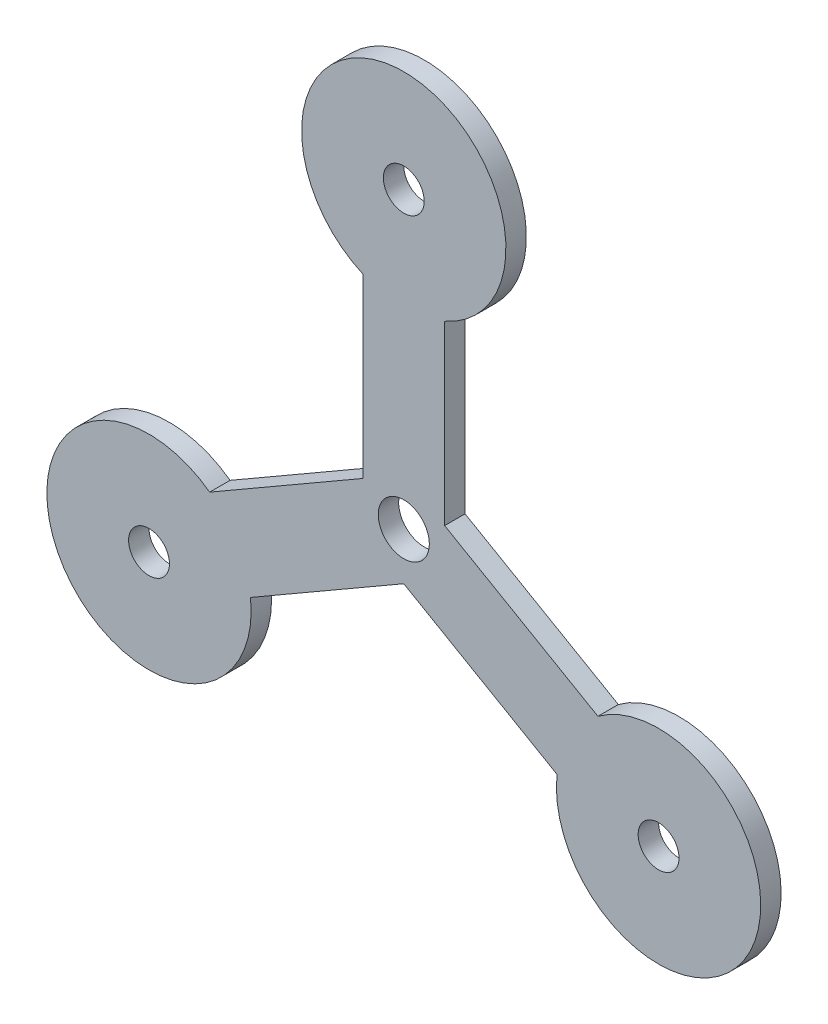
ISO-10303-21;
HEADER;
FILE_DESCRIPTION(('STEP AP214'),'2;1');
FILE_NAME('part.step','',(''),(''),'','','');
FILE_SCHEMA(('AUTOMOTIVE_DESIGN { 1 0 10303 214 1 1 1 1 }'));
ENDSEC;
DATA;
#1=APPLICATION_CONTEXT('core data for automotive mechanical design processes');
#2=APPLICATION_PROTOCOL_DEFINITION('international standard','automotive_design',2000,#1);
#3=PRODUCT_CONTEXT('',#1,'mechanical');
#4=PRODUCT('Part','Part','',(#3));
#5=PRODUCT_RELATED_PRODUCT_CATEGORY('part','',(#4));
#6=PRODUCT_DEFINITION_FORMATION('','',#4);
#7=PRODUCT_DEFINITION_CONTEXT('part definition',#1,'design');
#8=PRODUCT_DEFINITION('design','',#6,#7);
#9=PRODUCT_DEFINITION_SHAPE('','',#8);
#10=(LENGTH_UNIT() NAMED_UNIT(*) SI_UNIT(.MILLI.,.METRE.));
#11=(NAMED_UNIT(*) PLANE_ANGLE_UNIT() SI_UNIT($,.RADIAN.));
#12=(NAMED_UNIT(*) SI_UNIT($,.STERADIAN.) SOLID_ANGLE_UNIT());
#13=UNCERTAINTY_MEASURE_WITH_UNIT(LENGTH_MEASURE(1.E-05),#10,'distance_accuracy_value','');
#14=(GEOMETRIC_REPRESENTATION_CONTEXT(3) GLOBAL_UNCERTAINTY_ASSIGNED_CONTEXT((#13)) GLOBAL_UNIT_ASSIGNED_CONTEXT((#10,
#11,#12)) REPRESENTATION_CONTEXT('',''));
#15=CARTESIAN_POINT('',(0.,0.,0.));
#16=DIRECTION('',(0.,0.,1.));
#17=DIRECTION('',(1.,0.,0.));
#18=AXIS2_PLACEMENT_3D('',#15,#16,#17);
#19=CARTESIAN_POINT('',(-4.,2.30940107675855,6.));
#20=DIRECTION('',(1.,0.,0.));
#21=DIRECTION('',(0.,0.,-1.));
#22=AXIS2_PLACEMENT_3D('',#19,#20,#21);
#23=PLANE('',#22);
#24=DIRECTION('',(0.,-1.,0.));
#25=VECTOR('',#24,1.);
#26=CARTESIAN_POINT('',(-4.,2.30940107675855,6.));
#27=LINE('',#26,#25);
#28=CARTESIAN_POINT('',(-4.,19.6348486100883,6.));
#29=VERTEX_POINT('',#28);
#30=CARTESIAN_POINT('',(-4.,2.30940107675855,6.));
#31=VERTEX_POINT('',#30);
#32=EDGE_CURVE('E138',#29,#31,#27,.T.);
#33=ORIENTED_EDGE('',*,*,#32,.F.);
#34=DIRECTION('',(0.,0.,1.));
#35=VECTOR('',#34,1.);
#36=CARTESIAN_POINT('',(-4.,19.6348486100883,4.));
#37=LINE('',#36,#35);
#38=CARTESIAN_POINT('',(-4.,19.6348486100883,4.));
#39=VERTEX_POINT('',#38);
#40=EDGE_CURVE('E194',#29,#39,#37,.F.);
#41=ORIENTED_EDGE('',*,*,#40,.T.);
#42=DIRECTION('',(0.,-1.,0.));
#43=VECTOR('',#42,1.);
#44=CARTESIAN_POINT('',(-4.,2.30940107675855,4.));
#45=LINE('',#44,#43);
#46=CARTESIAN_POINT('',(-4.,2.30940107675855,4.));
#47=VERTEX_POINT('',#46);
#48=EDGE_CURVE('E165',#39,#47,#45,.T.);
#49=ORIENTED_EDGE('',*,*,#48,.T.);
#50=DIRECTION('',(0.,0.,-1.));
#51=VECTOR('',#50,1.);
#52=CARTESIAN_POINT('',(-4.,2.30940107675855,6.));
#53=LINE('',#52,#51);
#54=EDGE_CURVE('E11',#31,#47,#53,.T.);
#55=ORIENTED_EDGE('',*,*,#54,.F.);
#56=EDGE_LOOP('',(#33,#41,#49,#55));
#57=FACE_BOUND('',#56,.T.);
#58=ADVANCED_FACE('F38',(#57),#23,.F.);
#59=CARTESIAN_POINT('',(-26.9415316289919,-10.9358983848624,6.));
#60=DIRECTION('',(0.500000000000004,-0.866025403784436,0.));
#61=DIRECTION('',(0.866025403784436,0.500000000000004,0.));
#62=AXIS2_PLACEMENT_3D('',#59,#60,#61);
#63=PLANE('',#62);
#64=DIRECTION('',(-0.866025403784436,-0.500000000000004,0.));
#65=VECTOR('',#64,1.);
#66=CARTESIAN_POINT('',(-26.9415316289919,-10.9358983848624,4.));
#67=LINE('',#66,#65);
#68=CARTESIAN_POINT('',(-19.0042776957981,-6.35332268990647,4.));
#69=VERTEX_POINT('',#68);
#70=EDGE_CURVE('E163',#47,#69,#67,.T.);
#71=ORIENTED_EDGE('',*,*,#70,.T.);
#72=DIRECTION('',(0.,0.,1.));
#73=VECTOR('',#72,1.);
#74=CARTESIAN_POINT('',(-19.0042776957981,-6.35332268990647,4.));
#75=LINE('',#74,#73);
#76=CARTESIAN_POINT('',(-19.0042776957981,-6.35332268990647,6.));
#77=VERTEX_POINT('',#76);
#78=EDGE_CURVE('E170',#69,#77,#75,.T.);
#79=ORIENTED_EDGE('',*,*,#78,.T.);
#80=DIRECTION('',(-0.866025403784436,-0.500000000000004,0.));
#81=VECTOR('',#80,1.);
#82=CARTESIAN_POINT('',(-26.9415316289919,-10.9358983848624,6.));
#83=LINE('',#82,#81);
#84=EDGE_CURVE('E181',#31,#77,#83,.T.);
#85=ORIENTED_EDGE('',*,*,#84,.F.);
#86=ORIENTED_EDGE('',*,*,#54,.T.);
#87=EDGE_LOOP('',(#71,#79,#85,#86));
#88=FACE_BOUND('',#87,.T.);
#89=ADVANCED_FACE('F272',(#88),#63,.F.);
#90=CARTESIAN_POINT('',(0.,-4.61880215351695,6.));
#91=DIRECTION('',(-0.500000000000005,0.866025403784436,0.));
#92=DIRECTION('',(-0.866025403784436,-0.500000000000005,0.));
#93=AXIS2_PLACEMENT_3D('',#90,#91,#92);
#94=PLANE('',#93);
#95=DIRECTION('',(0.866025403784436,0.500000000000004,0.));
#96=VECTOR('',#95,1.);
#97=CARTESIAN_POINT('',(0.,-4.61880215351695,6.));
#98=LINE('',#97,#96);
#99=CARTESIAN_POINT('',(-15.0042776957981,-13.281525920182,6.));
#100=VERTEX_POINT('',#99);
#101=CARTESIAN_POINT('',(0.,-4.61880215351695,6.));
#102=VERTEX_POINT('',#101);
#103=EDGE_CURVE('E178',#100,#102,#98,.T.);
#104=ORIENTED_EDGE('',*,*,#103,.F.);
#105=DIRECTION('',(0.,0.,1.));
#106=VECTOR('',#105,1.);
#107=CARTESIAN_POINT('',(-15.0042776957981,-13.281525920182,4.));
#108=LINE('',#107,#106);
#109=CARTESIAN_POINT('',(-15.0042776957981,-13.281525920182,4.));
#110=VERTEX_POINT('',#109);
#111=EDGE_CURVE('E189',#100,#110,#108,.F.);
#112=ORIENTED_EDGE('',*,*,#111,.T.);
#113=DIRECTION('',(0.866025403784436,0.500000000000004,0.));
#114=VECTOR('',#113,1.);
#115=CARTESIAN_POINT('',(0.,-4.61880215351695,4.));
#116=LINE('',#115,#114);
#117=CARTESIAN_POINT('',(0.,-4.61880215351695,4.));
#118=VERTEX_POINT('',#117);
#119=EDGE_CURVE('E140',#110,#118,#116,.T.);
#120=ORIENTED_EDGE('',*,*,#119,.T.);
#121=DIRECTION('',(0.,0.,-1.));
#122=VECTOR('',#121,1.);
#123=CARTESIAN_POINT('',(0.,-4.61880215351695,6.));
#124=LINE('',#123,#122);
#125=EDGE_CURVE('E46',#102,#118,#124,.T.);
#126=ORIENTED_EDGE('',*,*,#125,.F.);
#127=EDGE_LOOP('',(#104,#112,#120,#126));
#128=FACE_BOUND('',#127,.T.);
#129=ADVANCED_FACE('F267',(#128),#94,.F.);
#130=CARTESIAN_POINT('',(22.9415316289919,-17.8641016151379,6.));
#131=DIRECTION('',(0.500000000000004,0.866025403784436,0.));
#132=DIRECTION('',(-0.866025403784436,0.500000000000004,0.));
#133=AXIS2_PLACEMENT_3D('',#130,#131,#132);
#134=PLANE('',#133);
#135=DIRECTION('',(0.866025403784436,-0.500000000000004,0.));
#136=VECTOR('',#135,1.);
#137=CARTESIAN_POINT('',(22.9415316289919,-17.8641016151379,4.));
#138=LINE('',#137,#136);
#139=CARTESIAN_POINT('',(15.004277695798,-13.2815259201819,4.));
#140=VERTEX_POINT('',#139);
#141=EDGE_CURVE('E134',#118,#140,#138,.T.);
#142=ORIENTED_EDGE('',*,*,#141,.T.);
#143=DIRECTION('',(0.,0.,1.));
#144=VECTOR('',#143,1.);
#145=CARTESIAN_POINT('',(15.004277695798,-13.2815259201819,4.));
#146=LINE('',#145,#144);
#147=CARTESIAN_POINT('',(15.004277695798,-13.2815259201819,6.));
#148=VERTEX_POINT('',#147);
#149=EDGE_CURVE('E113',#140,#148,#146,.T.);
#150=ORIENTED_EDGE('',*,*,#149,.T.);
#151=DIRECTION('',(0.866025403784436,-0.500000000000004,0.));
#152=VECTOR('',#151,1.);
#153=CARTESIAN_POINT('',(22.9415316289919,-17.8641016151379,6.));
#154=LINE('',#153,#152);
#155=EDGE_CURVE('E153',#102,#148,#154,.T.);
#156=ORIENTED_EDGE('',*,*,#155,.F.);
#157=ORIENTED_EDGE('',*,*,#125,.T.);
#158=EDGE_LOOP('',(#142,#150,#156,#157));
#159=FACE_BOUND('',#158,.T.);
#160=ADVANCED_FACE('F152',(#159),#134,.F.);
#161=CARTESIAN_POINT('',(4.,2.30940107675855,6.));
#162=DIRECTION('',(-0.500000000000004,-0.866025403784436,0.));
#163=DIRECTION('',(0.866025403784436,-0.500000000000004,0.));
#164=AXIS2_PLACEMENT_3D('',#161,#162,#163);
#165=PLANE('',#164);
#166=DIRECTION('',(-0.866025403784436,0.500000000000004,0.));
#167=VECTOR('',#166,1.);
#168=CARTESIAN_POINT('',(4.,2.30940107675855,6.));
#169=LINE('',#168,#167);
#170=CARTESIAN_POINT('',(19.0042776957982,-6.35332268990654,6.));
#171=VERTEX_POINT('',#170);
#172=CARTESIAN_POINT('',(4.,2.30940107675855,6.));
#173=VERTEX_POINT('',#172);
#174=EDGE_CURVE('E125',#171,#173,#169,.T.);
#175=ORIENTED_EDGE('',*,*,#174,.F.);
#176=DIRECTION('',(0.,0.,1.));
#177=VECTOR('',#176,1.);
#178=CARTESIAN_POINT('',(19.0042776957982,-6.35332268990653,4.));
#179=LINE('',#178,#177);
#180=CARTESIAN_POINT('',(19.0042776957982,-6.35332268990654,4.));
#181=VERTEX_POINT('',#180);
#182=EDGE_CURVE('E110',#171,#181,#179,.F.);
#183=ORIENTED_EDGE('',*,*,#182,.T.);
#184=DIRECTION('',(-0.866025403784436,0.500000000000004,0.));
#185=VECTOR('',#184,1.);
#186=CARTESIAN_POINT('',(4.,2.30940107675855,4.));
#187=LINE('',#186,#185);
#188=CARTESIAN_POINT('',(4.,2.30940107675855,4.));
#189=VERTEX_POINT('',#188);
#190=EDGE_CURVE('E123',#181,#189,#187,.T.);
#191=ORIENTED_EDGE('',*,*,#190,.T.);
#192=DIRECTION('',(0.,0.,-1.));
#193=VECTOR('',#192,1.);
#194=CARTESIAN_POINT('',(4.,2.30940107675855,6.));
#195=LINE('',#194,#193);
#196=EDGE_CURVE('E144',#173,#189,#195,.T.);
#197=ORIENTED_EDGE('',*,*,#196,.F.);
#198=EDGE_LOOP('',(#175,#183,#191,#197));
#199=FACE_BOUND('',#198,.T.);
#200=ADVANCED_FACE('F121',(#199),#165,.F.);
#201=CARTESIAN_POINT('',(4.,28.7999999999999,6.));
#202=DIRECTION('',(-1.,0.,0.));
#203=DIRECTION('',(0.,0.,1.));
#204=AXIS2_PLACEMENT_3D('',#201,#202,#203);
#205=PLANE('',#204);
#206=DIRECTION('',(0.,1.,0.));
#207=VECTOR('',#206,1.);
#208=CARTESIAN_POINT('',(4.,28.7999999999999,4.));
#209=LINE('',#208,#207);
#210=CARTESIAN_POINT('',(4.,19.6348486100882,4.));
#211=VERTEX_POINT('',#210);
#212=EDGE_CURVE('E132',#189,#211,#209,.T.);
#213=ORIENTED_EDGE('',*,*,#212,.T.);
#214=DIRECTION('',(0.,0.,1.));
#215=VECTOR('',#214,1.);
#216=CARTESIAN_POINT('',(4.,19.6348486100882,4.));
#217=LINE('',#216,#215);
#218=CARTESIAN_POINT('',(4.,19.6348486100882,6.));
#219=VERTEX_POINT('',#218);
#220=EDGE_CURVE('E200',#211,#219,#217,.T.);
#221=ORIENTED_EDGE('',*,*,#220,.T.);
#222=DIRECTION('',(0.,1.,0.));
#223=VECTOR('',#222,1.);
#224=CARTESIAN_POINT('',(4.,28.7999999999999,6.));
#225=LINE('',#224,#223);
#226=EDGE_CURVE('E146',#173,#219,#225,.T.);
#227=ORIENTED_EDGE('',*,*,#226,.F.);
#228=ORIENTED_EDGE('',*,*,#196,.T.);
#229=EDGE_LOOP('',(#213,#221,#227,#228));
#230=FACE_BOUND('',#229,.T.);
#231=ADVANCED_FACE('F260',(#230),#205,.F.);
#232=CARTESIAN_POINT('',(0.,-1.0304583715064E-13,6.));
#233=DIRECTION('',(0.,0.,1.));
#234=DIRECTION('',(1.,0.,0.));
#235=AXIS2_PLACEMENT_3D('',#232,#233,#234);
#236=PLANE('',#235);
#237=CARTESIAN_POINT('',(0.,-1.0304583715064E-13,6.));
#238=DIRECTION('',(0.,0.,1.));
#239=DIRECTION('',(1.,0.,0.));
#240=AXIS2_PLACEMENT_3D('',#237,#238,#239);
#241=CIRCLE('',#240,2.5);
#242=CARTESIAN_POINT('',(2.5,-1.0304583715064E-13,6.));
#243=VERTEX_POINT('',#242);
#244=EDGE_CURVE('E240',#243,#243,#241,.T.);
#245=ORIENTED_EDGE('',*,*,#244,.F.);
#246=EDGE_LOOP('',(#245));
#247=FACE_BOUND('',#246,.T.);
#248=CARTESIAN_POINT('',(-24.9415316289901,-14.3999999999989,6.));
#249=DIRECTION('',(0.,0.,1.));
#250=DIRECTION('',(1.,0.,0.));
#251=AXIS2_PLACEMENT_3D('',#248,#249,#250);
#252=CIRCLE('',#251,2.00000000000074);
#253=CARTESIAN_POINT('',(-22.9415316289893,-14.3999999999989,6.));
#254=VERTEX_POINT('',#253);
#255=EDGE_CURVE('E219',#254,#254,#252,.T.);
#256=ORIENTED_EDGE('',*,*,#255,.F.);
#257=EDGE_LOOP('',(#256));
#258=FACE_BOUND('',#257,.T.);
#259=CARTESIAN_POINT('',(24.9415316289898,-14.3999999999994,6.));
#260=DIRECTION('',(0.,0.,1.));
#261=DIRECTION('',(1.,0.,0.));
#262=AXIS2_PLACEMENT_3D('',#259,#260,#261);
#263=CIRCLE('',#262,2.00000000000074);
#264=CARTESIAN_POINT('',(26.9415316289905,-14.3999999999994,6.));
#265=VERTEX_POINT('',#264);
#266=EDGE_CURVE('E214',#265,#265,#263,.T.);
#267=ORIENTED_EDGE('',*,*,#266,.F.);
#268=EDGE_LOOP('',(#267));
#269=FACE_BOUND('',#268,.T.);
#270=CARTESIAN_POINT('',(2.85464967499275E-13,28.7999999999978,6.));
#271=DIRECTION('',(0.,0.,1.));
#272=DIRECTION('',(1.,0.,0.));
#273=AXIS2_PLACEMENT_3D('',#270,#271,#272);
#274=CIRCLE('',#273,2.00000000000074);
#275=CARTESIAN_POINT('',(2.00000000000102,28.7999999999978,6.));
#276=VERTEX_POINT('',#275);
#277=EDGE_CURVE('E223',#276,#276,#274,.T.);
#278=ORIENTED_EDGE('',*,*,#277,.F.);
#279=EDGE_LOOP('',(#278));
#280=FACE_BOUND('',#279,.T.);
#281=ORIENTED_EDGE('',*,*,#155,.T.);
#282=CARTESIAN_POINT('',(24.9415316289917,-14.4000000000003,6.));
#283=DIRECTION('',(0.,0.,1.));
#284=DIRECTION('',(1.,0.,0.));
#285=AXIS2_PLACEMENT_3D('',#282,#283,#284);
#286=CIRCLE('',#285,10.);
#287=EDGE_CURVE('E53',#148,#171,#286,.T.);
#288=ORIENTED_EDGE('',*,*,#287,.T.);
#289=ORIENTED_EDGE('',*,*,#174,.T.);
#290=ORIENTED_EDGE('',*,*,#226,.T.);
#291=CARTESIAN_POINT('',(1.45299310640349E-13,28.7999999999999,6.));
#292=DIRECTION('',(0.,0.,1.));
#293=DIRECTION('',(1.,0.,0.));
#294=AXIS2_PLACEMENT_3D('',#291,#292,#293);
#295=CIRCLE('',#294,10.);
#296=EDGE_CURVE('E205',#219,#29,#295,.T.);
#297=ORIENTED_EDGE('',*,*,#296,.T.);
#298=ORIENTED_EDGE('',*,*,#32,.T.);
#299=ORIENTED_EDGE('',*,*,#84,.T.);
#300=CARTESIAN_POINT('',(-24.9415316289918,-14.4000000000001,6.));
#301=DIRECTION('',(0.,0.,1.));
#302=DIRECTION('',(1.,0.,0.));
#303=AXIS2_PLACEMENT_3D('',#300,#301,#302);
#304=CIRCLE('',#303,10.);
#305=EDGE_CURVE('E60',#77,#100,#304,.T.);
#306=ORIENTED_EDGE('',*,*,#305,.T.);
#307=ORIENTED_EDGE('',*,*,#103,.T.);
#308=EDGE_LOOP('',(#281,#288,#289,#290,#297,#298,#299,#306,#307));
#309=FACE_BOUND('',#308,.T.);
#310=ADVANCED_FACE('F257',(#247,#258,#269,#280,#309),#236,.T.);
#311=CARTESIAN_POINT('',(0.,-1.0304583715064E-13,4.));
#312=DIRECTION('',(0.,0.,1.));
#313=DIRECTION('',(1.,0.,0.));
#314=AXIS2_PLACEMENT_3D('',#311,#312,#313);
#315=PLANE('',#314);
#316=CARTESIAN_POINT('',(0.,-1.0304583715064E-13,4.));
#317=DIRECTION('',(0.,0.,1.));
#318=DIRECTION('',(1.,0.,0.));
#319=AXIS2_PLACEMENT_3D('',#316,#317,#318);
#320=CIRCLE('',#319,2.5);
#321=CARTESIAN_POINT('',(2.5,-1.0304583715064E-13,4.));
#322=VERTEX_POINT('',#321);
#323=EDGE_CURVE('E233',#322,#322,#320,.T.);
#324=ORIENTED_EDGE('',*,*,#323,.T.);
#325=EDGE_LOOP('',(#324));
#326=FACE_BOUND('',#325,.T.);
#327=CARTESIAN_POINT('',(-24.9415316289901,-14.3999999999989,4.));
#328=DIRECTION('',(0.,0.,1.));
#329=DIRECTION('',(1.,0.,0.));
#330=AXIS2_PLACEMENT_3D('',#327,#328,#329);
#331=CIRCLE('',#330,2.00000000000074);
#332=CARTESIAN_POINT('',(-22.9415316289893,-14.3999999999989,4.));
#333=VERTEX_POINT('',#332);
#334=EDGE_CURVE('E227',#333,#333,#331,.T.);
#335=ORIENTED_EDGE('',*,*,#334,.T.);
#336=EDGE_LOOP('',(#335));
#337=FACE_BOUND('',#336,.T.);
#338=CARTESIAN_POINT('',(2.85464967499275E-13,28.7999999999978,4.));
#339=DIRECTION('',(0.,0.,1.));
#340=DIRECTION('',(1.,0.,0.));
#341=AXIS2_PLACEMENT_3D('',#338,#339,#340);
#342=CIRCLE('',#341,2.00000000000074);
#343=CARTESIAN_POINT('',(2.00000000000102,28.7999999999978,4.));
#344=VERTEX_POINT('',#343);
#345=EDGE_CURVE('E232',#344,#344,#342,.T.);
#346=ORIENTED_EDGE('',*,*,#345,.T.);
#347=EDGE_LOOP('',(#346));
#348=FACE_BOUND('',#347,.T.);
#349=CARTESIAN_POINT('',(24.9415316289898,-14.3999999999994,4.));
#350=DIRECTION('',(0.,0.,1.));
#351=DIRECTION('',(1.,0.,0.));
#352=AXIS2_PLACEMENT_3D('',#349,#350,#351);
#353=CIRCLE('',#352,2.00000000000074);
#354=CARTESIAN_POINT('',(26.9415316289905,-14.3999999999994,4.));
#355=VERTEX_POINT('',#354);
#356=EDGE_CURVE('E228',#355,#355,#353,.T.);
#357=ORIENTED_EDGE('',*,*,#356,.T.);
#358=EDGE_LOOP('',(#357));
#359=FACE_BOUND('',#358,.T.);
#360=ORIENTED_EDGE('',*,*,#190,.F.);
#361=CARTESIAN_POINT('',(24.9415316289917,-14.4000000000003,4.));
#362=DIRECTION('',(0.,0.,1.));
#363=DIRECTION('',(1.,0.,0.));
#364=AXIS2_PLACEMENT_3D('',#361,#362,#363);
#365=CIRCLE('',#364,10.);
#366=EDGE_CURVE('E107',#140,#181,#365,.T.);
#367=ORIENTED_EDGE('',*,*,#366,.F.);
#368=ORIENTED_EDGE('',*,*,#141,.F.);
#369=ORIENTED_EDGE('',*,*,#119,.F.);
#370=CARTESIAN_POINT('',(-24.9415316289918,-14.4000000000001,4.));
#371=DIRECTION('',(0.,0.,1.));
#372=DIRECTION('',(1.,0.,0.));
#373=AXIS2_PLACEMENT_3D('',#370,#371,#372);
#374=CIRCLE('',#373,10.);
#375=EDGE_CURVE('E159',#69,#110,#374,.T.);
#376=ORIENTED_EDGE('',*,*,#375,.F.);
#377=ORIENTED_EDGE('',*,*,#70,.F.);
#378=ORIENTED_EDGE('',*,*,#48,.F.);
#379=CARTESIAN_POINT('',(1.45299310640349E-13,28.7999999999999,4.));
#380=DIRECTION('',(0.,0.,1.));
#381=DIRECTION('',(1.,0.,0.));
#382=AXIS2_PLACEMENT_3D('',#379,#380,#381);
#383=CIRCLE('',#382,10.);
#384=EDGE_CURVE('E204',#211,#39,#383,.T.);
#385=ORIENTED_EDGE('',*,*,#384,.F.);
#386=ORIENTED_EDGE('',*,*,#212,.F.);
#387=EDGE_LOOP('',(#360,#367,#368,#369,#376,#377,#378,#385,#386));
#388=FACE_BOUND('',#387,.T.);
#389=ADVANCED_FACE('F129',(#326,#337,#348,#359,#388),#315,.F.);
#390=CARTESIAN_POINT('',(-24.9415316289918,-14.4000000000001,4.));
#391=DIRECTION('',(0.,0.,1.));
#392=DIRECTION('',(1.,0.,0.));
#393=AXIS2_PLACEMENT_3D('',#390,#391,#392);
#394=CYLINDRICAL_SURFACE('',#393,10.);
#395=ORIENTED_EDGE('',*,*,#78,.F.);
#396=ORIENTED_EDGE('',*,*,#375,.T.);
#397=ORIENTED_EDGE('',*,*,#111,.F.);
#398=ORIENTED_EDGE('',*,*,#305,.F.);
#399=EDGE_LOOP('',(#395,#396,#397,#398));
#400=FACE_BOUND('',#399,.T.);
#401=ADVANCED_FACE('F269',(#400),#394,.T.);
#402=CARTESIAN_POINT('',(1.45299310640349E-13,28.7999999999999,4.));
#403=DIRECTION('',(0.,0.,1.));
#404=DIRECTION('',(1.,0.,0.));
#405=AXIS2_PLACEMENT_3D('',#402,#403,#404);
#406=CYLINDRICAL_SURFACE('',#405,10.);
#407=ORIENTED_EDGE('',*,*,#40,.F.);
#408=ORIENTED_EDGE('',*,*,#296,.F.);
#409=ORIENTED_EDGE('',*,*,#220,.F.);
#410=ORIENTED_EDGE('',*,*,#384,.T.);
#411=EDGE_LOOP('',(#407,#408,#409,#410));
#412=FACE_BOUND('',#411,.T.);
#413=ADVANCED_FACE('F280',(#412),#406,.T.);
#414=CARTESIAN_POINT('',(24.9415316289917,-14.4000000000003,4.));
#415=DIRECTION('',(0.,0.,1.));
#416=DIRECTION('',(1.,0.,0.));
#417=AXIS2_PLACEMENT_3D('',#414,#415,#416);
#418=CYLINDRICAL_SURFACE('',#417,10.);
#419=ORIENTED_EDGE('',*,*,#149,.F.);
#420=ORIENTED_EDGE('',*,*,#366,.T.);
#421=ORIENTED_EDGE('',*,*,#182,.F.);
#422=ORIENTED_EDGE('',*,*,#287,.F.);
#423=EDGE_LOOP('',(#419,#420,#421,#422));
#424=FACE_BOUND('',#423,.T.);
#425=ADVANCED_FACE('F109',(#424),#418,.T.);
#426=CARTESIAN_POINT('',(24.9415316289898,-14.3999999999994,4.));
#427=DIRECTION('',(0.,0.,1.));
#428=DIRECTION('',(1.,0.,0.));
#429=AXIS2_PLACEMENT_3D('',#426,#427,#428);
#430=CYLINDRICAL_SURFACE('',#429,2.00000000000074);
#431=ORIENTED_EDGE('',*,*,#266,.T.);
#432=EDGE_LOOP('',(#431));
#433=FACE_BOUND('',#432,.T.);
#434=ORIENTED_EDGE('',*,*,#356,.F.);
#435=EDGE_LOOP('',(#434));
#436=FACE_BOUND('',#435,.T.);
#437=ADVANCED_FACE('F287',(#433,#436),#430,.F.);
#438=CARTESIAN_POINT('',(2.85464967499275E-13,28.7999999999978,4.));
#439=DIRECTION('',(0.,0.,1.));
#440=DIRECTION('',(1.,0.,0.));
#441=AXIS2_PLACEMENT_3D('',#438,#439,#440);
#442=CYLINDRICAL_SURFACE('',#441,2.00000000000074);
#443=ORIENTED_EDGE('',*,*,#277,.T.);
#444=EDGE_LOOP('',(#443));
#445=FACE_BOUND('',#444,.T.);
#446=ORIENTED_EDGE('',*,*,#345,.F.);
#447=EDGE_LOOP('',(#446));
#448=FACE_BOUND('',#447,.T.);
#449=ADVANCED_FACE('F335',(#445,#448),#442,.F.);
#450=CARTESIAN_POINT('',(-24.9415316289901,-14.3999999999989,4.));
#451=DIRECTION('',(0.,0.,1.));
#452=DIRECTION('',(1.,0.,0.));
#453=AXIS2_PLACEMENT_3D('',#450,#451,#452);
#454=CYLINDRICAL_SURFACE('',#453,2.00000000000074);
#455=ORIENTED_EDGE('',*,*,#255,.T.);
#456=EDGE_LOOP('',(#455));
#457=FACE_BOUND('',#456,.T.);
#458=ORIENTED_EDGE('',*,*,#334,.F.);
#459=EDGE_LOOP('',(#458));
#460=FACE_BOUND('',#459,.T.);
#461=ADVANCED_FACE('F253',(#457,#460),#454,.F.);
#462=CARTESIAN_POINT('',(0.,-1.0304583715064E-13,4.));
#463=DIRECTION('',(0.,0.,1.));
#464=DIRECTION('',(1.,0.,0.));
#465=AXIS2_PLACEMENT_3D('',#462,#463,#464);
#466=CYLINDRICAL_SURFACE('',#465,2.5);
#467=ORIENTED_EDGE('',*,*,#323,.F.);
#468=EDGE_LOOP('',(#467));
#469=FACE_BOUND('',#468,.T.);
#470=ORIENTED_EDGE('',*,*,#244,.T.);
#471=EDGE_LOOP('',(#470));
#472=FACE_BOUND('',#471,.T.);
#473=ADVANCED_FACE('F250',(#469,#472),#466,.F.);
#474=CLOSED_SHELL('',(#58,#89,#129,#160,#200,#231,#310,#389,#401,#413,#425,#437,#449,#461,#473));
#475=MANIFOLD_SOLID_BREP('B2',#474);
#476=ADVANCED_BREP_SHAPE_REPRESENTATION('',(#18,#475),#14);
#477=SHAPE_DEFINITION_REPRESENTATION(#9,#476);
ENDSEC;
END-ISO-10303-21;
